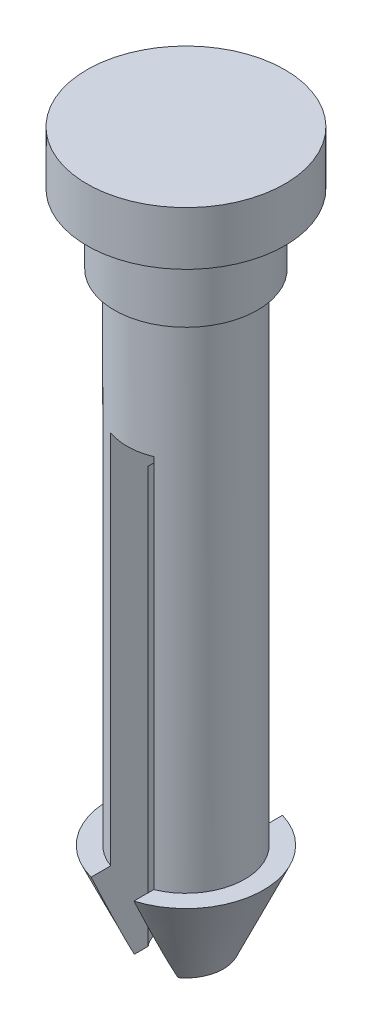
ISO-10303-21;
HEADER;
FILE_DESCRIPTION(('STEP AP214'),'2;1');
FILE_NAME('part.step','',(''),(''),'','','');
FILE_SCHEMA(('AUTOMOTIVE_DESIGN { 1 0 10303 214 1 1 1 1 }'));
ENDSEC;
DATA;
#1=APPLICATION_CONTEXT('core data for automotive mechanical design processes');
#2=APPLICATION_PROTOCOL_DEFINITION('international standard','automotive_design',2000,#1);
#3=PRODUCT_CONTEXT('',#1,'mechanical');
#4=PRODUCT('Part','Part','',(#3));
#5=PRODUCT_RELATED_PRODUCT_CATEGORY('part','',(#4));
#6=PRODUCT_DEFINITION_FORMATION('','',#4);
#7=PRODUCT_DEFINITION_CONTEXT('part definition',#1,'design');
#8=PRODUCT_DEFINITION('design','',#6,#7);
#9=PRODUCT_DEFINITION_SHAPE('','',#8);
#10=(LENGTH_UNIT() NAMED_UNIT(*) SI_UNIT(.MILLI.,.METRE.));
#11=(NAMED_UNIT(*) PLANE_ANGLE_UNIT() SI_UNIT($,.RADIAN.));
#12=(NAMED_UNIT(*) SI_UNIT($,.STERADIAN.) SOLID_ANGLE_UNIT());
#13=UNCERTAINTY_MEASURE_WITH_UNIT(LENGTH_MEASURE(1.E-05),#10,'distance_accuracy_value','');
#14=(GEOMETRIC_REPRESENTATION_CONTEXT(3) GLOBAL_UNCERTAINTY_ASSIGNED_CONTEXT((#13)) GLOBAL_UNIT_ASSIGNED_CONTEXT((#10,
#11,#12)) REPRESENTATION_CONTEXT('',''));
#15=CARTESIAN_POINT('',(0.,0.,0.));
#16=DIRECTION('',(0.,0.,1.));
#17=DIRECTION('',(1.,0.,0.));
#18=AXIS2_PLACEMENT_3D('',#15,#16,#17);
#19=CARTESIAN_POINT('',(1.17474999999923,-7.,0.));
#20=DIRECTION('',(0.,1.,0.));
#21=DIRECTION('',(0.,0.,1.));
#22=AXIS2_PLACEMENT_3D('',#19,#20,#21);
#23=PLANE('',#22);
#24=CARTESIAN_POINT('',(-8.88178419700125E-13,-7.,0.));
#25=DIRECTION('',(0.,-1.,0.));
#26=DIRECTION('',(0.,0.,-1.));
#27=AXIS2_PLACEMENT_3D('',#24,#25,#26);
#28=CIRCLE('',#27,0.634999999999941);
#29=CARTESIAN_POINT('',(-0.470809730698272,-7.,0.426102332169847));
#30=VERTEX_POINT('',#29);
#31=CARTESIAN_POINT('',(-0.470809730698272,-7.,-0.426102332169847));
#32=VERTEX_POINT('',#31);
#33=EDGE_CURVE('E153',#30,#32,#28,.T.);
#34=ORIENTED_EDGE('',*,*,#33,.T.);
#35=DIRECTION('',(0.,0.,1.));
#36=VECTOR('',#35,1.);
#37=CARTESIAN_POINT('',(-0.470809730698272,-7.,0.));
#38=LINE('',#37,#36);
#39=EDGE_CURVE('E60',#32,#30,#38,.T.);
#40=ORIENTED_EDGE('',*,*,#39,.T.);
#41=EDGE_LOOP('',(#34,#40));
#42=FACE_BOUND('',#41,.T.);
#43=ADVANCED_FACE('F37',(#42),#23,.F.);
#44=CARTESIAN_POINT('',(-8.88178419700125E-13,-7.,0.));
#45=DIRECTION('',(0.,-1.,0.));
#46=DIRECTION('',(0.,0.,-1.));
#47=AXIS2_PLACEMENT_3D('',#44,#45,#46);
#48=CYLINDRICAL_SURFACE('',#47,0.634999999999941);
#49=CARTESIAN_POINT('',(-8.88178419700125E-13,-16.8699999999994,0.));
#50=DIRECTION('',(0.,-1.,0.));
#51=DIRECTION('',(0.,0.,-1.));
#52=AXIS2_PLACEMENT_3D('',#49,#50,#51);
#53=CIRCLE('',#52,0.634999999999942);
#54=CARTESIAN_POINT('',(-0.470809730698272,-16.8699999999994,0.426102332169847));
#55=VERTEX_POINT('',#54);
#56=CARTESIAN_POINT('',(-0.470809730698272,-16.8699999999994,-0.426102332169847));
#57=VERTEX_POINT('',#56);
#58=EDGE_CURVE('E159',#55,#57,#53,.T.);
#59=ORIENTED_EDGE('',*,*,#58,.T.);
#60=DIRECTION('',(0.,-1.,0.));
#61=VECTOR('',#60,1.);
#62=CARTESIAN_POINT('',(-0.470809730698272,-7.,-0.426102332169847));
#63=LINE('',#62,#61);
#64=EDGE_CURVE('E186',#57,#32,#63,.F.);
#65=ORIENTED_EDGE('',*,*,#64,.T.);
#66=ORIENTED_EDGE('',*,*,#33,.F.);
#67=DIRECTION('',(0.,-1.,0.));
#68=VECTOR('',#67,1.);
#69=CARTESIAN_POINT('',(-0.470809730698272,-7.,0.426102332169847));
#70=LINE('',#69,#68);
#71=EDGE_CURVE('E189',#30,#55,#70,.T.);
#72=ORIENTED_EDGE('',*,*,#71,.T.);
#73=EDGE_LOOP('',(#59,#65,#66,#72));
#74=FACE_BOUND('',#73,.T.);
#75=ADVANCED_FACE('F249',(#74),#48,.F.);
#76=CARTESIAN_POINT('',(1.17474999999923,-16.8699999999994,0.));
#77=DIRECTION('',(0.,-1.,0.));
#78=DIRECTION('',(0.,0.,-1.));
#79=AXIS2_PLACEMENT_3D('',#76,#77,#78);
#80=PLANE('',#79);
#81=DIRECTION('',(0.,0.,1.));
#82=VECTOR('',#81,1.);
#83=CARTESIAN_POINT('',(-0.470809730698272,-16.8699999999994,-2.34950000000023));
#84=LINE('',#83,#82);
#85=CARTESIAN_POINT('',(-0.470809730698272,-16.8699999999994,0.754094952564773));
#86=VERTEX_POINT('',#85);
#87=EDGE_CURVE('E285',#55,#86,#84,.T.);
#88=ORIENTED_EDGE('',*,*,#87,.T.);
#89=CARTESIAN_POINT('',(-8.88178419700125E-13,-16.8699999999994,0.));
#90=DIRECTION('',(0.,-1.,0.));
#91=DIRECTION('',(0.,0.,-1.));
#92=AXIS2_PLACEMENT_3D('',#89,#90,#91);
#93=CIRCLE('',#92,0.889000000001693);
#94=CARTESIAN_POINT('',(-0.470809730698272,-16.8699999999994,-0.754094952564773));
#95=VERTEX_POINT('',#94);
#96=EDGE_CURVE('E163',#86,#95,#93,.T.);
#97=ORIENTED_EDGE('',*,*,#96,.T.);
#98=EDGE_CURVE('E288',#95,#57,#84,.T.);
#99=ORIENTED_EDGE('',*,*,#98,.T.);
#100=ORIENTED_EDGE('',*,*,#58,.F.);
#101=EDGE_LOOP('',(#88,#97,#99,#100));
#102=FACE_BOUND('',#101,.T.);
#103=ADVANCED_FACE('F254',(#102),#80,.T.);
#104=CARTESIAN_POINT('',(-8.88178419700125E-13,-16.8699999999994,0.));
#105=DIRECTION('',(0.,1.,0.));
#106=DIRECTION('',(0.,0.,1.));
#107=AXIS2_PLACEMENT_3D('',#104,#105,#106);
#108=CONICAL_SURFACE('',#107,0.889000000001693,0.425819956289818);
#109=CARTESIAN_POINT('',(-0.470809730698272,-12.2260201274479,2.95814453395055));
#110=CARTESIAN_POINT('',(-0.470809730698272,-12.3861873378487,2.88458099140499));
#111=CARTESIAN_POINT('',(-0.470809730698272,-12.5463303405119,2.8109646012091));
#112=CARTESIAN_POINT('',(-0.470809730698272,-12.8665515000916,2.66358955267845));
#113=CARTESIAN_POINT('',(-0.470809730698272,-13.0266296567936,2.58983089387761));
#114=CARTESIAN_POINT('',(-0.470809730698272,-13.5068671373411,2.36822900631571));
#115=CARTESIAN_POINT('',(-0.470809730698272,-13.8269028398649,2.22011795755414));
#116=CARTESIAN_POINT('',(-0.470809730698272,-14.4677305745664,1.92206633705601));
#117=CARTESIAN_POINT('',(-0.470809730698272,-14.7885202790242,1.77212073810345));
#118=CARTESIAN_POINT('',(-0.470809730698272,-15.2687392430162,1.54528791026428));
#119=CARTESIAN_POINT('',(-0.470809730698272,-15.4286259813358,1.46937010574911));
#120=CARTESIAN_POINT('',(-0.470809730698272,-15.7479099331174,1.31651431717505));
#121=CARTESIAN_POINT('',(-0.470809730698272,-15.9073071547452,1.23957635024893));
#122=CARTESIAN_POINT('',(-0.470809730698272,-16.178315831669,1.10693779894612));
#123=CARTESIAN_POINT('',(-0.470809730698272,-16.2901407741781,1.05167385945556));
#124=CARTESIAN_POINT('',(-0.470809730698272,-16.5131963257658,0.939775969769587));
#125=CARTESIAN_POINT('',(-0.470809730698272,-16.6244265190418,0.883141183731017));
#126=CARTESIAN_POINT('',(-0.470809730698272,-16.7904705924992,0.796428096386344));
#127=CARTESIAN_POINT('',(-0.470809730698272,-16.8457304754893,0.767205336594314));
#128=CARTESIAN_POINT('',(-0.470809730698272,-16.9558232332675,0.707967970002227));
#129=CARTESIAN_POINT('',(-0.470809730698272,-17.0106561271852,0.677953398943462));
#130=CARTESIAN_POINT('',(-0.470809730698272,-17.119636791346,0.616832856283982));
#131=CARTESIAN_POINT('',(-0.470809730698272,-17.173785215373,0.585728053340448));
#132=CARTESIAN_POINT('',(-0.470809730698272,-17.281090032285,0.521859689022776));
#133=CARTESIAN_POINT('',(-0.470809730698272,-17.3342467323304,0.489096653319924));
#134=CARTESIAN_POINT('',(-0.470809730698272,-17.4128224209207,0.43779919615567));
#135=CARTESIAN_POINT('',(-0.470809730698272,-17.4389026961878,0.420281660314202));
#136=CARTESIAN_POINT('',(-0.470809730698272,-17.4904417332709,0.384300421206581));
#137=CARTESIAN_POINT('',(-0.470809730698272,-17.515899953029,0.365835933337449));
#138=CARTESIAN_POINT('',(-0.470809730698272,-17.5657585541173,0.327701549186028));
#139=CARTESIAN_POINT('',(-0.470809730698272,-17.5901624316084,0.308036259062385));
#140=CARTESIAN_POINT('',(-0.470809730698272,-17.6374054216459,0.266927515692687));
#141=CARTESIAN_POINT('',(-0.470809730698272,-17.660247084515,0.2454870933199));
#142=CARTESIAN_POINT('',(-0.470809730698272,-17.6972559004493,0.206227480282792));
#143=CARTESIAN_POINT('',(-0.470809730698272,-17.712079932297,0.189036424325389));
#144=CARTESIAN_POINT('',(-0.470809730698272,-17.7393210211487,0.152827188978844));
#145=CARTESIAN_POINT('',(-0.470809730698272,-17.7517451516811,0.133814634039353));
#146=CARTESIAN_POINT('',(-0.470809730698272,-17.7684124093819,0.101606170249138));
#147=CARTESIAN_POINT('',(-0.470809730698272,-17.7739465132029,0.0890905578822579));
#148=CARTESIAN_POINT('',(-0.470809730698272,-17.7830119464227,0.0633528702439097));
#149=CARTESIAN_POINT('',(-0.470809730698272,-17.7865466803604,0.050132038101519));
#150=CARTESIAN_POINT('',(-0.470809730698272,-17.7911707857728,0.0231126189869575));
#151=CARTESIAN_POINT('',(-0.470809730698272,-17.792235020988,0.00930953579117423));
#152=CARTESIAN_POINT('',(-0.470809730698272,-17.7916601838809,-0.0182408958798548));
#153=CARTESIAN_POINT('',(-0.470809730698272,-17.7900202608318,-0.0319882254509877));
#154=CARTESIAN_POINT('',(-0.470809730698272,-17.784006756348,-0.0603784077131516));
#155=CARTESIAN_POINT('',(-0.470809730698272,-17.7793619180222,-0.0749617925286813));
#156=CARTESIAN_POINT('',(-0.470809730698272,-17.767796109979,-0.103192981643412));
#157=CARTESIAN_POINT('',(-0.470809730698272,-17.7608699340265,-0.116838558871612));
#158=CARTESIAN_POINT('',(-0.470809730698272,-17.7392836281929,-0.153645572262469));
#159=CARTESIAN_POINT('',(-0.470809730698272,-17.7228530865712,-0.175745670624571));
#160=CARTESIAN_POINT('',(-0.470809730698272,-17.6872666988298,-0.21761807423319));
#161=CARTESIAN_POINT('',(-0.470809730698272,-17.6681002761906,-0.237380774366789));
#162=CARTESIAN_POINT('',(-0.470809730698272,-17.6281231544347,-0.275298669442681));
#163=CARTESIAN_POINT('',(-0.470809730698272,-17.607306684051,-0.293447704576166));
#164=CARTESIAN_POINT('',(-0.470809730698272,-17.5646673994099,-0.328532460503883));
#165=CARTESIAN_POINT('',(-0.470809730698272,-17.5428438593004,-0.345467282966935));
#166=CARTESIAN_POINT('',(-0.470809730698272,-17.4762843433911,-0.395016334827364));
#167=CARTESIAN_POINT('',(-0.470809730698272,-17.4305570141264,-0.426289624692166));
#168=CARTESIAN_POINT('',(-0.470809730698272,-17.3375238334446,-0.486885243848947));
#169=CARTESIAN_POINT('',(-0.470809730698272,-17.2902109472631,-0.516196452263764));
#170=CARTESIAN_POINT('',(-0.470809730698272,-17.1948251441032,-0.573373554656358));
#171=CARTESIAN_POINT('',(-0.470809730698272,-17.1467535624201,-0.60124168331969));
#172=CARTESIAN_POINT('',(-0.470809730698272,-17.003095324364,-0.682665228655817));
#173=CARTESIAN_POINT('',(-0.470809730698272,-16.9067421227866,-0.734858802434074));
#174=CARTESIAN_POINT('',(-0.470809730698272,-16.7129866509305,-0.837272909567071));
#175=CARTESIAN_POINT('',(-0.470809730698272,-16.6155841966646,-0.88749308946678));
#176=CARTESIAN_POINT('',(-0.470809730698272,-16.4200535687171,-0.986745210949291));
#177=CARTESIAN_POINT('',(-0.470809730698272,-16.3219247644245,-1.0357759085003));
#178=CARTESIAN_POINT('',(-0.470809730698272,-16.1252704763456,-1.13301229524577));
#179=CARTESIAN_POINT('',(-0.470809730698272,-16.0267450243349,-1.18121804896401));
#180=CARTESIAN_POINT('',(-0.470809730698272,-15.731744277929,-1.32451215120482));
#181=CARTESIAN_POINT('',(-0.470809730698272,-15.5348646966091,-1.41876717861059));
#182=CARTESIAN_POINT('',(-0.470809730698272,-15.1406167470558,-1.60603658240751));
#183=CARTESIAN_POINT('',(-0.470809730698272,-14.9432486081617,-1.69905144416232));
#184=CARTESIAN_POINT('',(-0.470809730698272,-14.536666866245,-1.8897268135741));
#185=CARTESIAN_POINT('',(-0.470809730698272,-14.3274323282341,-1.98734266872962));
#186=CARTESIAN_POINT('',(-0.470809730698272,-13.9086863764602,-2.18205493568063));
#187=CARTESIAN_POINT('',(-0.470809730698272,-13.6991749279897,-2.27915127272574));
#188=CARTESIAN_POINT('',(-0.470809730698272,-13.2791093548758,-2.47338624604243));
#189=CARTESIAN_POINT('',(-0.470809730698272,-13.0685545293939,-2.57052336600799));
#190=CARTESIAN_POINT('',(-0.470809730698272,-12.6473526666993,-2.76451653777276));
#191=CARTESIAN_POINT('',(-0.470809730698272,-12.4367056474333,-2.86137262852985));
#192=CARTESIAN_POINT('',(-0.470809730698272,-12.2260201274479,-2.95814453395056));
#193=B_SPLINE_CURVE_WITH_KNOTS('',3,(#109,#110,#111,#112,#113,#114,#115,#116,#117,#118,#119,
#120,#121,#122,#123,#124,#125,#126,#127,#128,#129,#130,#131,#132,#133,#134,#135,#136,#137,#138,
#139,#140,#141,#142,#143,#144,#145,#146,#147,#148,#149,#150,#151,#152,#153,#154,#155,#156,#157,
#158,#159,#160,#161,#162,#163,#164,#165,#166,#167,#168,#169,#170,#171,#172,#173,#174,#175,#176,
#177,#178,#179,#180,#181,#182,#183,#184,#185,#186,#187,#188,#189,#190,#191,#192),.UNSPECIFIED.,
.F.,.F.,(4,2,2,2,2,2,2,2,2,2,2,2,2,2,2,2,2,2,2,2,2,2,2,2,2,2,2,2,2,2,2,2,2,2,2,2,2,2,2,2,2,4),
(0.,0.528759175756597,1.05752008665531,2.11545986865274,3.17776475954834,3.7087485635449,
4.23972346138097,4.61392577440305,4.98836230155992,5.17589118080636,5.36341160968686,
5.55073683256414,5.738003039513,5.83224144022656,5.92655922558464,6.02053553730242,
6.11435457749019,6.18234422419618,6.25013031198348,6.29105686589758,6.33191351839977,
6.37318408148828,6.41446763075279,6.46012577036965,6.50588883671659,6.58804142797064,
6.67052067224798,6.7533023368714,6.83614462841166,7.00221701625081,7.16916247630006,
7.33584116710091,7.66453461560356,7.99328667058437,8.32236889917343,8.65142526954299,
9.30625172026876,9.96081388845298,10.6534679140323,11.3462190568943,12.0418628463355,
12.737405092438),.UNSPECIFIED.);
#194=CARTESIAN_POINT('',(-0.470809730698272,-14.7699999999999,1.78029785358565));
#195=VERTEX_POINT('',#194);
#196=EDGE_CURVE('E193',#195,#86,#193,.T.);
#197=ORIENTED_EDGE('',*,*,#196,.F.);
#198=CARTESIAN_POINT('',(-8.88178419700125E-13,-14.7699999999999,0.));
#199=DIRECTION('',(0.,-1.,0.));
#200=DIRECTION('',(0.,0.,-1.));
#201=AXIS2_PLACEMENT_3D('',#198,#199,#200);
#202=CIRCLE('',#201,1.84150000000027);
#203=CARTESIAN_POINT('',(-0.470809730698272,-14.7699999999999,-1.78029785358565));
#204=VERTEX_POINT('',#203);
#205=EDGE_CURVE('E167',#195,#204,#202,.T.);
#206=ORIENTED_EDGE('',*,*,#205,.T.);
#207=EDGE_CURVE('E192',#95,#204,#193,.T.);
#208=ORIENTED_EDGE('',*,*,#207,.F.);
#209=ORIENTED_EDGE('',*,*,#96,.F.);
#210=EDGE_LOOP('',(#197,#206,#208,#209));
#211=FACE_BOUND('',#210,.T.);
#212=ADVANCED_FACE('F245',(#211),#108,.T.);
#213=CARTESIAN_POINT('',(1.17474999999923,-14.7699999999999,0.));
#214=DIRECTION('',(0.,1.,0.));
#215=DIRECTION('',(0.,0.,1.));
#216=AXIS2_PLACEMENT_3D('',#213,#214,#215);
#217=PLANE('',#216);
#218=DIRECTION('',(0.,0.,1.));
#219=VECTOR('',#218,1.);
#220=CARTESIAN_POINT('',(-0.470809730698272,-14.7699999999999,0.));
#221=LINE('',#220,#219);
#222=CARTESIAN_POINT('',(-0.470809730698272,-14.7699999999999,-1.31527457113914));
#223=VERTEX_POINT('',#222);
#224=EDGE_CURVE('E201',#204,#223,#221,.T.);
#225=ORIENTED_EDGE('',*,*,#224,.F.);
#226=ORIENTED_EDGE('',*,*,#205,.F.);
#227=CARTESIAN_POINT('',(-0.470809730698272,-14.7699999999999,1.31527457113914));
#228=VERTEX_POINT('',#227);
#229=EDGE_CURVE('E202',#228,#195,#221,.T.);
#230=ORIENTED_EDGE('',*,*,#229,.F.);
#231=CARTESIAN_POINT('',(-8.88178419700125E-13,-14.7699999999999,0.));
#232=DIRECTION('',(0.,-1.,0.));
#233=DIRECTION('',(0.,0.,-1.));
#234=AXIS2_PLACEMENT_3D('',#231,#232,#233);
#235=CIRCLE('',#234,1.39700000000165);
#236=EDGE_CURVE('E170',#228,#223,#235,.T.);
#237=ORIENTED_EDGE('',*,*,#236,.T.);
#238=EDGE_LOOP('',(#225,#226,#230,#237));
#239=FACE_BOUND('',#238,.T.);
#240=ADVANCED_FACE('F239',(#239),#217,.T.);
#241=CARTESIAN_POINT('',(0.529190269301728,-7.,-0.350973872069346));
#242=VERTEX_POINT('',#241);
#243=CARTESIAN_POINT('',(0.529190269301728,-7.,0.350973872069346));
#244=VERTEX_POINT('',#243);
#245=EDGE_CURVE('E150',#242,#244,#28,.T.);
#246=ORIENTED_EDGE('',*,*,#245,.T.);
#247=DIRECTION('',(0.,0.,-1.));
#248=VECTOR('',#247,1.);
#249=CARTESIAN_POINT('',(0.529190269301728,-7.,0.));
#250=LINE('',#249,#248);
#251=EDGE_CURVE('E266',#244,#242,#250,.T.);
#252=ORIENTED_EDGE('',*,*,#251,.T.);
#253=EDGE_LOOP('',(#246,#252));
#254=FACE_BOUND('',#253,.T.);
#255=ADVANCED_FACE('F39',(#254),#23,.F.);
#256=CARTESIAN_POINT('',(0.529190269301728,-16.8699999999994,-0.350973872069347));
#257=VERTEX_POINT('',#256);
#258=CARTESIAN_POINT('',(0.529190269301728,-16.8699999999994,0.350973872069347));
#259=VERTEX_POINT('',#258);
#260=EDGE_CURVE('E156',#257,#259,#53,.T.);
#261=ORIENTED_EDGE('',*,*,#260,.T.);
#262=DIRECTION('',(0.,-1.,0.));
#263=VECTOR('',#262,1.);
#264=CARTESIAN_POINT('',(0.529190269301728,-7.,0.350973872069346));
#265=LINE('',#264,#263);
#266=EDGE_CURVE('E271',#259,#244,#265,.F.);
#267=ORIENTED_EDGE('',*,*,#266,.T.);
#268=ORIENTED_EDGE('',*,*,#245,.F.);
#269=DIRECTION('',(0.,-1.,0.));
#270=VECTOR('',#269,1.);
#271=CARTESIAN_POINT('',(0.529190269301728,-7.,-0.350973872069346));
#272=LINE('',#271,#270);
#273=EDGE_CURVE('E269',#242,#257,#272,.T.);
#274=ORIENTED_EDGE('',*,*,#273,.T.);
#275=EDGE_LOOP('',(#261,#267,#268,#274));
#276=FACE_BOUND('',#275,.T.);
#277=ADVANCED_FACE('F256',(#276),#48,.F.);
#278=DIRECTION('',(0.,0.,1.));
#279=VECTOR('',#278,1.);
#280=CARTESIAN_POINT('',(0.529190269301728,-16.8699999999994,-2.34950000000023));
#281=LINE('',#280,#279);
#282=CARTESIAN_POINT('',(0.529190269301728,-16.8699999999994,-0.714337916450215));
#283=VERTEX_POINT('',#282);
#284=EDGE_CURVE('E140',#283,#257,#281,.T.);
#285=ORIENTED_EDGE('',*,*,#284,.F.);
#286=CARTESIAN_POINT('',(0.529190269301728,-16.8699999999994,0.714337916450215));
#287=VERTEX_POINT('',#286);
#288=EDGE_CURVE('E160',#283,#287,#93,.T.);
#289=ORIENTED_EDGE('',*,*,#288,.T.);
#290=EDGE_CURVE('E289',#259,#287,#281,.T.);
#291=ORIENTED_EDGE('',*,*,#290,.F.);
#292=ORIENTED_EDGE('',*,*,#260,.F.);
#293=EDGE_LOOP('',(#285,#289,#291,#292));
#294=FACE_BOUND('',#293,.T.);
#295=ADVANCED_FACE('F243',(#294),#80,.T.);
#296=CARTESIAN_POINT('',(0.529190269301728,-12.2260201274479,-2.94826025736133));
#297=CARTESIAN_POINT('',(0.529190269301728,-12.3849122311102,-2.87503906331659));
#298=CARTESIAN_POINT('',(0.529190269301728,-12.5437726743472,-2.80174932428088));
#299=CARTESIAN_POINT('',(0.529190269301728,-12.8614122258983,-2.65499137648794));
#300=CARTESIAN_POINT('',(0.529190269301728,-13.0201913337291,-2.58152316668482));
#301=CARTESIAN_POINT('',(0.529190269301728,-13.4966273776933,-2.36067391338784));
#302=CARTESIAN_POINT('',(0.529190269301728,-13.8141321698003,-2.21296369305908));
#303=CARTESIAN_POINT('',(0.529190269301728,-14.2927969005448,-1.98882935019861));
#304=CARTESIAN_POINT('',(0.529190269301728,-14.4542301078896,-1.91298905356632));
#305=CARTESIAN_POINT('',(0.529190269301728,-14.7768200000972,-1.76072297720717));
#306=CARTESIAN_POINT('',(0.529190269301728,-14.9379766858393,-1.68429719934663));
#307=CARTESIAN_POINT('',(0.529190269301728,-15.2597721440804,-1.53063367265514));
#308=CARTESIAN_POINT('',(0.529190269301728,-15.4204111881793,-1.45339649294775));
#309=CARTESIAN_POINT('',(0.529190269301728,-15.7410388885329,-1.29758885556109));
#310=CARTESIAN_POINT('',(0.529190269301728,-15.9010275658514,-1.21901844149586));
#311=CARTESIAN_POINT('',(0.529190269301728,-16.1720280550102,-1.08347856945887));
#312=CARTESIAN_POINT('',(0.529190269301728,-16.283334871567,-1.02709965886154));
#313=CARTESIAN_POINT('',(0.529190269301728,-16.5051884747928,-0.912487328435589));
#314=CARTESIAN_POINT('',(0.529190269301728,-16.6157340502238,-0.85425153617986));
#315=CARTESIAN_POINT('',(0.529190269301728,-16.7801967117725,-0.764608751654839));
#316=CARTESIAN_POINT('',(0.529190269301728,-16.8347495048669,-0.734370852709005));
#317=CARTESIAN_POINT('',(0.529190269301728,-16.9432589431213,-0.672792256268184));
#318=CARTESIAN_POINT('',(0.529190269301728,-16.9972153780599,-0.641451185224708));
#319=CARTESIAN_POINT('',(0.529190269301728,-17.1040611410845,-0.577262638584467));
#320=CARTESIAN_POINT('',(0.529190269301728,-17.1569526015106,-0.544418720068294));
#321=CARTESIAN_POINT('',(0.529190269301728,-17.2611716038248,-0.476351657846932));
#322=CARTESIAN_POINT('',(0.529190269301728,-17.3125003338567,-0.441130390685028));
#323=CARTESIAN_POINT('',(0.529190269301728,-17.3821683830852,-0.389025510613597));
#324=CARTESIAN_POINT('',(0.529190269301728,-17.4017815205968,-0.373853647311679));
#325=CARTESIAN_POINT('',(0.529190269301728,-17.4403473581941,-0.342655355069152));
#326=CARTESIAN_POINT('',(0.529190269301728,-17.4592995447156,-0.326628285056716));
#327=CARTESIAN_POINT('',(0.529190269301728,-17.4961201093095,-0.293592250028326));
#328=CARTESIAN_POINT('',(0.529190269301728,-17.513994610251,-0.276590173167052));
#329=CARTESIAN_POINT('',(0.529190269301728,-17.5482921299351,-0.241193752805973));
#330=CARTESIAN_POINT('',(0.529190269301728,-17.5647172626198,-0.22280151215772));
#331=CARTESIAN_POINT('',(0.529190269301728,-17.5910122570284,-0.189566194404037));
#332=CARTESIAN_POINT('',(0.529190269301728,-17.6014324930232,-0.175164564833565));
#333=CARTESIAN_POINT('',(0.529190269301728,-17.6205645660059,-0.145214937813164));
#334=CARTESIAN_POINT('',(0.529190269301728,-17.6292742143072,-0.129665506288665));
#335=CARTESIAN_POINT('',(0.529190269301728,-17.6443269253392,-0.0971064097694575));
#336=CARTESIAN_POINT('',(0.529190269301728,-17.6506289794349,-0.0800770314537535));
#337=CARTESIAN_POINT('',(0.529190269301728,-17.6596657464885,-0.0451159906186747));
#338=CARTESIAN_POINT('',(0.529190269301728,-17.6624145820781,-0.0271881961554577));
#339=CARTESIAN_POINT('',(0.529190269301728,-17.6637007218362,0.00632130073674587));
#340=CARTESIAN_POINT('',(0.529190269301728,-17.6627696352826,0.0218832491283143));
#341=CARTESIAN_POINT('',(0.529190269301728,-17.6580261749506,0.0525717462054221));
#342=CARTESIAN_POINT('',(0.529190269301728,-17.6542083382244,0.0676974128510453));
#343=CARTESIAN_POINT('',(0.529190269301728,-17.6427603611839,0.101453813390511));
#344=CARTESIAN_POINT('',(0.529190269301728,-17.6343397870839,0.119808956646338));
#345=CARTESIAN_POINT('',(0.529190269301728,-17.6148330994984,0.155025865464313));
#346=CARTESIAN_POINT('',(0.529190269301728,-17.6037405745688,0.171883903436856));
#347=CARTESIAN_POINT('',(0.529190269301728,-17.5756566851766,0.209925200202507));
#348=CARTESIAN_POINT('',(0.529190269301728,-17.5579553871745,0.230574040632775));
#349=CARTESIAN_POINT('',(0.529190269301728,-17.5206687490754,0.270118523759485));
#350=CARTESIAN_POINT('',(0.529190269301728,-17.5010792123807,0.289010068994343));
#351=CARTESIAN_POINT('',(0.529190269301728,-17.4605705152309,0.325602495953861));
#352=CARTESIAN_POINT('',(0.529190269301728,-17.4396427026965,0.343293693500045));
#353=CARTESIAN_POINT('',(0.529190269301728,-17.3970035685667,0.377641814001204));
#354=CARTESIAN_POINT('',(0.529190269301728,-17.3752931650302,0.394299890240496));
#355=CARTESIAN_POINT('',(0.529190269301728,-17.3044765058823,0.446716668795919));
#356=CARTESIAN_POINT('',(0.529190269301728,-17.254268122415,0.480978318332873));
#357=CARTESIAN_POINT('',(0.529190269301728,-17.1523896417251,0.547269759623328));
#358=CARTESIAN_POINT('',(0.529190269301728,-17.1007185608173,0.579297996708758));
#359=CARTESIAN_POINT('',(0.529190269301728,-16.996370108464,0.641930506119902));
#360=CARTESIAN_POINT('',(0.529190269301728,-16.9436907951297,0.672531534521626));
#361=CARTESIAN_POINT('',(0.529190269301728,-16.8377585926911,0.732678190162708));
#362=CARTESIAN_POINT('',(0.529190269301728,-16.7845058810121,0.762224132316001));
#363=CARTESIAN_POINT('',(0.529190269301728,-16.6242677714159,0.849667627696676));
#364=CARTESIAN_POINT('',(0.529190269301728,-16.5166731408143,0.906446151965883));
#365=CARTESIAN_POINT('',(0.529190269301728,-16.3007334395502,1.01820344345399));
#366=CARTESIAN_POINT('',(0.529190269301728,-16.1923894723038,1.07318436717783));
#367=CARTESIAN_POINT('',(0.529190269301728,-15.9239331434907,1.20770036181799));
#368=CARTESIAN_POINT('',(0.529190269301728,-15.7634977910261,1.28658998828007));
#369=CARTESIAN_POINT('',(0.529190269301728,-15.4419580078688,1.44299860050375));
#370=CARTESIAN_POINT('',(0.529190269301728,-15.2808535551183,1.5205175406286));
#371=CARTESIAN_POINT('',(0.529190269301728,-14.958121177895,1.67472129723284));
#372=CARTESIAN_POINT('',(0.529190269301728,-14.7964929870054,1.75140555578193));
#373=CARTESIAN_POINT('',(0.529190269301728,-14.472955248881,1.9041783747151));
#374=CARTESIAN_POINT('',(0.529190269301728,-14.3110457008746,1.9802669334626));
#375=CARTESIAN_POINT('',(0.529190269301728,-13.98899605021,2.13109946552555));
#376=CARTESIAN_POINT('',(0.529190269301728,-13.8288583382293,2.2058485459777));
#377=CARTESIAN_POINT('',(0.529190269301728,-13.5084403883298,2.35504236396355));
#378=CARTESIAN_POINT('',(0.529190269301728,-13.3481601497621,2.4294871001026));
#379=CARTESIAN_POINT('',(0.529190269301728,-13.0276165091137,2.57808868000211));
#380=CARTESIAN_POINT('',(0.529190269301728,-12.8673531894193,2.65224570154229));
#381=CARTESIAN_POINT('',(0.529190269301728,-12.5467435143639,2.80037747300895));
#382=CARTESIAN_POINT('',(0.529190269301728,-12.3863971595171,2.87435222404832));
#383=CARTESIAN_POINT('',(0.529190269301728,-12.2260201274479,2.94826025736133));
#384=B_SPLINE_CURVE_WITH_KNOTS('',3,(#296,#297,#298,#299,#300,#301,#302,#303,#304,#305,#306,
#307,#308,#309,#310,#311,#312,#313,#314,#315,#316,#317,#318,#319,#320,#321,#322,#323,#324,#325,
#326,#327,#328,#329,#330,#331,#332,#333,#334,#335,#336,#337,#338,#339,#340,#341,#342,#343,#344,
#345,#346,#347,#348,#349,#350,#351,#352,#353,#354,#355,#356,#357,#358,#359,#360,#361,#362,#363,
#364,#365,#366,#367,#368,#369,#370,#371,#372,#373,#374,#375,#376,#377,#378,#379,#380,#381,#382,
#383),.UNSPECIFIED.,.F.,.F.,(4,2,2,2,2,2,2,2,2,2,2,2,2,2,2,2,2,2,2,2,2,2,2,2,2,2,2,2,2,2,2,2,2,
2,2,2,2,2,2,2,2,2,2,4),(0.,0.524854466032381,1.0497120152955,2.10025557469871,2.63533607376508,
3.17041486786674,3.70514055002839,4.23984877332385,4.61415506192599,4.98896042059499,
5.17607060457667,5.36324476781432,5.54999676605266,5.73660303892098,5.81097561722993,
5.88540475136426,5.95936082919742,6.03320719286639,6.08645048971762,6.13976147347918,
6.19394382392005,6.2479101520876,6.29438585619267,6.34094973272687,6.40119196040019,
6.46158020729041,6.54296740864605,6.62453985691737,6.70670698320978,6.78878067020912,
6.97100686278155,7.15335866143864,7.33610652547661,7.51879938052766,7.88373650309252,
8.24821843923775,8.78455083043944,9.32090104523602,9.85759011899025,10.3942806666793,
10.9244534135799,11.4546285872846,11.984394788507,12.514157747053),.UNSPECIFIED.);
#385=CARTESIAN_POINT('',(0.529190269301728,-14.7699999999999,-1.76382536235208));
#386=VERTEX_POINT('',#385);
#387=EDGE_CURVE('E277',#386,#283,#384,.T.);
#388=ORIENTED_EDGE('',*,*,#387,.F.);
#389=CARTESIAN_POINT('',(0.529190269301728,-14.7699999999999,1.76382536235208));
#390=VERTEX_POINT('',#389);
#391=EDGE_CURVE('E164',#386,#390,#202,.T.);
#392=ORIENTED_EDGE('',*,*,#391,.T.);
#393=EDGE_CURVE('E276',#287,#390,#384,.T.);
#394=ORIENTED_EDGE('',*,*,#393,.F.);
#395=ORIENTED_EDGE('',*,*,#288,.F.);
#396=EDGE_LOOP('',(#388,#392,#394,#395));
#397=FACE_BOUND('',#396,.T.);
#398=ADVANCED_FACE('F204',(#397),#108,.T.);
#399=DIRECTION('',(0.,0.,-1.));
#400=VECTOR('',#399,1.);
#401=CARTESIAN_POINT('',(0.529190269301728,-14.7699999999999,0.));
#402=LINE('',#401,#400);
#403=CARTESIAN_POINT('',(0.529190269301728,-14.7699999999999,1.29289081475584));
#404=VERTEX_POINT('',#403);
#405=EDGE_CURVE('E126',#390,#404,#402,.T.);
#406=ORIENTED_EDGE('',*,*,#405,.F.);
#407=ORIENTED_EDGE('',*,*,#391,.F.);
#408=CARTESIAN_POINT('',(0.529190269301728,-14.7699999999999,-1.29289081475584));
#409=VERTEX_POINT('',#408);
#410=EDGE_CURVE('E283',#409,#386,#402,.T.);
#411=ORIENTED_EDGE('',*,*,#410,.F.);
#412=EDGE_CURVE('E168',#409,#404,#235,.T.);
#413=ORIENTED_EDGE('',*,*,#412,.T.);
#414=EDGE_LOOP('',(#406,#407,#411,#413));
#415=FACE_BOUND('',#414,.T.);
#416=ADVANCED_FACE('F236',(#415),#217,.T.);
#417=CARTESIAN_POINT('',(-8.88178419700125E-13,-7.,0.));
#418=DIRECTION('',(0.,-1.,0.));
#419=DIRECTION('',(0.,0.,-1.));
#420=AXIS2_PLACEMENT_3D('',#417,#418,#419);
#421=CYLINDRICAL_SURFACE('',#420,1.39700000000165);
#422=DIRECTION('',(0.,-1.,0.));
#423=VECTOR('',#422,1.);
#424=CARTESIAN_POINT('',(-0.470809730698272,-7.,1.31527457113914));
#425=LINE('',#424,#423);
#426=CARTESIAN_POINT('',(-0.470809730698272,-5.86999999999943,1.31527457113914));
#427=VERTEX_POINT('',#426);
#428=EDGE_CURVE('E11',#427,#228,#425,.T.);
#429=ORIENTED_EDGE('',*,*,#428,.F.);
#430=CARTESIAN_POINT('',(-8.88178419700125E-13,-5.86999999999943,0.));
#431=DIRECTION('',(0.,1.,0.));
#432=DIRECTION('',(0.,0.,1.));
#433=AXIS2_PLACEMENT_3D('',#430,#431,#432);
#434=CIRCLE('',#433,1.39700000000165);
#435=CARTESIAN_POINT('',(0.529190269301728,-5.86999999999943,1.29289081475584));
#436=VERTEX_POINT('',#435);
#437=EDGE_CURVE('E45',#436,#427,#434,.F.);
#438=ORIENTED_EDGE('',*,*,#437,.F.);
#439=DIRECTION('',(0.,-1.,0.));
#440=VECTOR('',#439,1.);
#441=CARTESIAN_POINT('',(0.529190269301728,-7.,1.29289081475584));
#442=LINE('',#441,#440);
#443=EDGE_CURVE('E123',#404,#436,#442,.F.);
#444=ORIENTED_EDGE('',*,*,#443,.F.);
#445=ORIENTED_EDGE('',*,*,#412,.F.);
#446=DIRECTION('',(0.,-1.,0.));
#447=VECTOR('',#446,1.);
#448=CARTESIAN_POINT('',(0.529190269301728,-7.,-1.29289081475584));
#449=LINE('',#448,#447);
#450=CARTESIAN_POINT('',(0.529190269301728,-5.86999999999943,-1.29289081475584));
#451=VERTEX_POINT('',#450);
#452=EDGE_CURVE('E149',#451,#409,#449,.T.);
#453=ORIENTED_EDGE('',*,*,#452,.F.);
#454=CARTESIAN_POINT('',(-0.470809730698272,-5.86999999999943,-1.31527457113914));
#455=VERTEX_POINT('',#454);
#456=EDGE_CURVE('E137',#455,#451,#434,.F.);
#457=ORIENTED_EDGE('',*,*,#456,.F.);
#458=DIRECTION('',(0.,-1.,0.));
#459=VECTOR('',#458,1.);
#460=CARTESIAN_POINT('',(-0.470809730698272,-7.,-1.31527457113914));
#461=LINE('',#460,#459);
#462=EDGE_CURVE('E131',#223,#455,#461,.F.);
#463=ORIENTED_EDGE('',*,*,#462,.F.);
#464=ORIENTED_EDGE('',*,*,#236,.F.);
#465=EDGE_LOOP('',(#429,#438,#444,#445,#453,#457,#463,#464));
#466=FACE_BOUND('',#465,.T.);
#467=CARTESIAN_POINT('',(-8.88178419700125E-13,-2.92000000000048,0.));
#468=DIRECTION('',(0.,-1.,0.));
#469=DIRECTION('',(0.,0.,-1.));
#470=AXIS2_PLACEMENT_3D('',#467,#468,#469);
#471=CIRCLE('',#470,1.39700000000165);
#472=CARTESIAN_POINT('',(-8.88178419700125E-13,-2.92000000000048,-1.39700000000165));
#473=VERTEX_POINT('',#472);
#474=EDGE_CURVE('E171',#473,#473,#471,.T.);
#475=ORIENTED_EDGE('',*,*,#474,.T.);
#476=EDGE_LOOP('',(#475));
#477=FACE_BOUND('',#476,.T.);
#478=ADVANCED_FACE('F143',(#466,#477),#421,.T.);
#479=CARTESIAN_POINT('',(1.17474999999923,-2.92000000000048,0.));
#480=DIRECTION('',(0.,-1.,0.));
#481=DIRECTION('',(0.,0.,-1.));
#482=AXIS2_PLACEMENT_3D('',#479,#480,#481);
#483=PLANE('',#482);
#484=CARTESIAN_POINT('',(-8.88178419700125E-13,-2.92000000000048,0.));
#485=DIRECTION('',(0.,-1.,0.));
#486=DIRECTION('',(0.,0.,-1.));
#487=AXIS2_PLACEMENT_3D('',#484,#485,#486);
#488=CIRCLE('',#487,1.70000000000048);
#489=CARTESIAN_POINT('',(-8.88178419700125E-13,-2.92000000000048,-1.70000000000048));
#490=VERTEX_POINT('',#489);
#491=EDGE_CURVE('E174',#490,#490,#488,.T.);
#492=ORIENTED_EDGE('',*,*,#491,.T.);
#493=EDGE_LOOP('',(#492));
#494=FACE_BOUND('',#493,.T.);
#495=ORIENTED_EDGE('',*,*,#474,.F.);
#496=EDGE_LOOP('',(#495));
#497=FACE_BOUND('',#496,.T.);
#498=ADVANCED_FACE('F230',(#494,#497),#483,.T.);
#499=CARTESIAN_POINT('',(-8.88178419700125E-13,-7.,0.));
#500=DIRECTION('',(0.,-1.,0.));
#501=DIRECTION('',(0.,0.,-1.));
#502=AXIS2_PLACEMENT_3D('',#499,#500,#501);
#503=CYLINDRICAL_SURFACE('',#502,1.70000000000048);
#504=CARTESIAN_POINT('',(-8.88178419700125E-13,-1.26999999999988,0.));
#505=DIRECTION('',(0.,-1.,0.));
#506=DIRECTION('',(0.,0.,-1.));
#507=AXIS2_PLACEMENT_3D('',#504,#505,#506);
#508=CIRCLE('',#507,1.70000000000048);
#509=CARTESIAN_POINT('',(-8.88178419700125E-13,-1.26999999999988,-1.70000000000048));
#510=VERTEX_POINT('',#509);
#511=EDGE_CURVE('E177',#510,#510,#508,.T.);
#512=ORIENTED_EDGE('',*,*,#511,.T.);
#513=EDGE_LOOP('',(#512));
#514=FACE_BOUND('',#513,.T.);
#515=ORIENTED_EDGE('',*,*,#491,.F.);
#516=EDGE_LOOP('',(#515));
#517=FACE_BOUND('',#516,.T.);
#518=ADVANCED_FACE('F226',(#514,#517),#503,.T.);
#519=CARTESIAN_POINT('',(1.17474999999923,-1.26999999999988,0.));
#520=DIRECTION('',(0.,-1.,0.));
#521=DIRECTION('',(0.,0.,-1.));
#522=AXIS2_PLACEMENT_3D('',#519,#520,#521);
#523=PLANE('',#522);
#524=CARTESIAN_POINT('',(-8.88178419700125E-13,-1.26999999999988,0.));
#525=DIRECTION('',(0.,-1.,0.));
#526=DIRECTION('',(0.,0.,-1.));
#527=AXIS2_PLACEMENT_3D('',#524,#525,#526);
#528=CIRCLE('',#527,2.34950000000023);
#529=CARTESIAN_POINT('',(-8.88178419700125E-13,-1.26999999999988,-2.34950000000023));
#530=VERTEX_POINT('',#529);
#531=EDGE_CURVE('E180',#530,#530,#528,.T.);
#532=ORIENTED_EDGE('',*,*,#531,.T.);
#533=EDGE_LOOP('',(#532));
#534=FACE_BOUND('',#533,.T.);
#535=ORIENTED_EDGE('',*,*,#511,.F.);
#536=EDGE_LOOP('',(#535));
#537=FACE_BOUND('',#536,.T.);
#538=ADVANCED_FACE('F222',(#534,#537),#523,.T.);
#539=CARTESIAN_POINT('',(-8.88178419700125E-13,-7.,0.));
#540=DIRECTION('',(0.,-1.,0.));
#541=DIRECTION('',(0.,0.,-1.));
#542=AXIS2_PLACEMENT_3D('',#539,#540,#541);
#543=CYLINDRICAL_SURFACE('',#542,2.34950000000023);
#544=CARTESIAN_POINT('',(-8.88178419700125E-13,0.,0.));
#545=DIRECTION('',(0.,-1.,0.));
#546=DIRECTION('',(0.,0.,-1.));
#547=AXIS2_PLACEMENT_3D('',#544,#545,#546);
#548=CIRCLE('',#547,2.34950000000023);
#549=CARTESIAN_POINT('',(-8.88178419700125E-13,0.,-2.34950000000023));
#550=VERTEX_POINT('',#549);
#551=EDGE_CURVE('E183',#550,#550,#548,.T.);
#552=ORIENTED_EDGE('',*,*,#551,.T.);
#553=EDGE_LOOP('',(#552));
#554=FACE_BOUND('',#553,.T.);
#555=ORIENTED_EDGE('',*,*,#531,.F.);
#556=EDGE_LOOP('',(#555));
#557=FACE_BOUND('',#556,.T.);
#558=ADVANCED_FACE('F218',(#554,#557),#543,.T.);
#559=CARTESIAN_POINT('',(1.17474999999923,0.,0.));
#560=DIRECTION('',(0.,1.,0.));
#561=DIRECTION('',(0.,0.,1.));
#562=AXIS2_PLACEMENT_3D('',#559,#560,#561);
#563=PLANE('',#562);
#564=ORIENTED_EDGE('',*,*,#551,.F.);
#565=EDGE_LOOP('',(#564));
#566=FACE_BOUND('',#565,.T.);
#567=ADVANCED_FACE('F213',(#566),#563,.T.);
#568=CARTESIAN_POINT('',(-0.470809730698272,-16.8699999999994,-2.34950000000023));
#569=DIRECTION('',(-1.,0.,0.));
#570=DIRECTION('',(0.,0.,1.));
#571=AXIS2_PLACEMENT_3D('',#568,#569,#570);
#572=PLANE('',#571);
#573=ORIENTED_EDGE('',*,*,#98,.F.);
#574=ORIENTED_EDGE('',*,*,#207,.T.);
#575=ORIENTED_EDGE('',*,*,#224,.T.);
#576=ORIENTED_EDGE('',*,*,#462,.T.);
#577=DIRECTION('',(0.,0.,1.));
#578=VECTOR('',#577,1.);
#579=CARTESIAN_POINT('',(-0.470809730698272,-5.86999999999943,-2.34950000000023));
#580=LINE('',#579,#578);
#581=EDGE_CURVE('E139',#455,#427,#580,.T.);
#582=ORIENTED_EDGE('',*,*,#581,.T.);
#583=ORIENTED_EDGE('',*,*,#428,.T.);
#584=ORIENTED_EDGE('',*,*,#229,.T.);
#585=ORIENTED_EDGE('',*,*,#196,.T.);
#586=ORIENTED_EDGE('',*,*,#87,.F.);
#587=ORIENTED_EDGE('',*,*,#71,.F.);
#588=ORIENTED_EDGE('',*,*,#39,.F.);
#589=ORIENTED_EDGE('',*,*,#64,.F.);
#590=EDGE_LOOP('',(#573,#574,#575,#576,#582,#583,#584,#585,#586,#587,#588,#589));
#591=FACE_BOUND('',#590,.T.);
#592=ADVANCED_FACE('F208',(#591),#572,.F.);
#593=CARTESIAN_POINT('',(0.529190269301728,-16.8699999999994,-2.34950000000023));
#594=DIRECTION('',(1.,0.,0.));
#595=DIRECTION('',(0.,0.,-1.));
#596=AXIS2_PLACEMENT_3D('',#593,#594,#595);
#597=PLANE('',#596);
#598=ORIENTED_EDGE('',*,*,#290,.T.);
#599=ORIENTED_EDGE('',*,*,#393,.T.);
#600=ORIENTED_EDGE('',*,*,#405,.T.);
#601=ORIENTED_EDGE('',*,*,#443,.T.);
#602=DIRECTION('',(0.,0.,1.));
#603=VECTOR('',#602,1.);
#604=CARTESIAN_POINT('',(0.529190269301728,-5.86999999999943,-2.34950000000023));
#605=LINE('',#604,#603);
#606=EDGE_CURVE('E52',#451,#436,#605,.T.);
#607=ORIENTED_EDGE('',*,*,#606,.F.);
#608=ORIENTED_EDGE('',*,*,#452,.T.);
#609=ORIENTED_EDGE('',*,*,#410,.T.);
#610=ORIENTED_EDGE('',*,*,#387,.T.);
#611=ORIENTED_EDGE('',*,*,#284,.T.);
#612=ORIENTED_EDGE('',*,*,#273,.F.);
#613=ORIENTED_EDGE('',*,*,#251,.F.);
#614=ORIENTED_EDGE('',*,*,#266,.F.);
#615=EDGE_LOOP('',(#598,#599,#600,#601,#607,#608,#609,#610,#611,#612,#613,#614));
#616=FACE_BOUND('',#615,.T.);
#617=ADVANCED_FACE('F124',(#616),#597,.F.);
#618=CARTESIAN_POINT('',(-0.470809730698272,-5.86999999999943,-2.34950000000023));
#619=DIRECTION('',(0.,1.,0.));
#620=DIRECTION('',(0.,0.,1.));
#621=AXIS2_PLACEMENT_3D('',#618,#619,#620);
#622=PLANE('',#621);
#623=ORIENTED_EDGE('',*,*,#456,.T.);
#624=ORIENTED_EDGE('',*,*,#606,.T.);
#625=ORIENTED_EDGE('',*,*,#437,.T.);
#626=ORIENTED_EDGE('',*,*,#581,.F.);
#627=EDGE_LOOP('',(#623,#624,#625,#626));
#628=FACE_BOUND('',#627,.T.);
#629=ADVANCED_FACE('F133',(#628),#622,.F.);
#630=CLOSED_SHELL('',(#43,#75,#103,#212,#240,#255,#277,#295,#398,#416,#478,#498,#518,#538,#558,
#567,#592,#617,#629));
#631=MANIFOLD_SOLID_BREP('B2',#630);
#632=ADVANCED_BREP_SHAPE_REPRESENTATION('',(#18,#631),#14);
#633=SHAPE_DEFINITION_REPRESENTATION(#9,#632);
ENDSEC;
END-ISO-10303-21;
